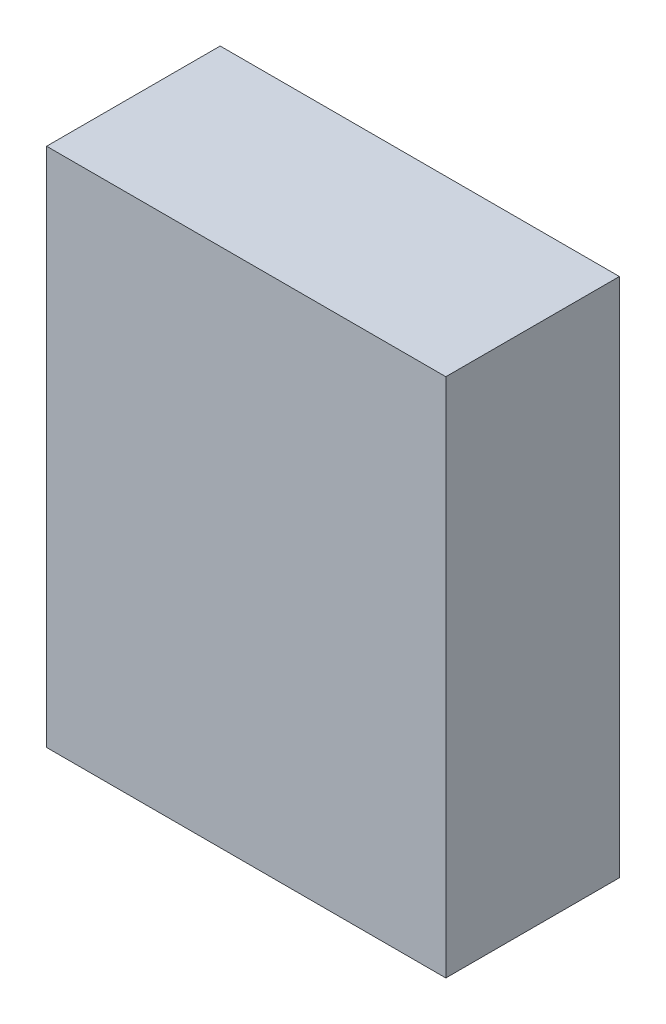
ISO-10303-21;
HEADER;
FILE_DESCRIPTION(('STEP AP214'),'2;1');
FILE_NAME('part.step','',(''),(''),'','','');
FILE_SCHEMA(('AUTOMOTIVE_DESIGN { 1 0 10303 214 1 1 1 1 }'));
ENDSEC;
DATA;
#1=APPLICATION_CONTEXT('core data for automotive mechanical design processes');
#2=APPLICATION_PROTOCOL_DEFINITION('international standard','automotive_design',2000,#1);
#3=PRODUCT_CONTEXT('',#1,'mechanical');
#4=PRODUCT('Part','Part','',(#3));
#5=PRODUCT_RELATED_PRODUCT_CATEGORY('part','',(#4));
#6=PRODUCT_DEFINITION_FORMATION('','',#4);
#7=PRODUCT_DEFINITION_CONTEXT('part definition',#1,'design');
#8=PRODUCT_DEFINITION('design','',#6,#7);
#9=PRODUCT_DEFINITION_SHAPE('','',#8);
#10=(LENGTH_UNIT() NAMED_UNIT(*) SI_UNIT(.MILLI.,.METRE.));
#11=(NAMED_UNIT(*) PLANE_ANGLE_UNIT() SI_UNIT($,.RADIAN.));
#12=(NAMED_UNIT(*) SI_UNIT($,.STERADIAN.) SOLID_ANGLE_UNIT());
#13=UNCERTAINTY_MEASURE_WITH_UNIT(LENGTH_MEASURE(1.E-05),#10,'distance_accuracy_value','');
#14=(GEOMETRIC_REPRESENTATION_CONTEXT(3) GLOBAL_UNCERTAINTY_ASSIGNED_CONTEXT((#13)) GLOBAL_UNIT_ASSIGNED_CONTEXT((#10,
#11,#12)) REPRESENTATION_CONTEXT('',''));
#15=CARTESIAN_POINT('',(0.,0.,0.));
#16=DIRECTION('',(0.,0.,1.));
#17=DIRECTION('',(1.,0.,0.));
#18=AXIS2_PLACEMENT_3D('',#15,#16,#17);
#19=CARTESIAN_POINT('',(-48.481774921507,22.1003401360544,50.));
#20=DIRECTION('',(1.,0.,0.));
#21=DIRECTION('',(0.,1.,0.));
#22=AXIS2_PLACEMENT_3D('',#19,#20,#21);
#23=PLANE('',#22);
#24=DIRECTION('',(0.,-1.,0.));
#25=VECTOR('',#24,1.);
#26=CARTESIAN_POINT('',(-48.481774921507,22.1003401360544,0.));
#27=LINE('',#26,#25);
#28=CARTESIAN_POINT('',(-48.481774921507,22.1003401360544,0.));
#29=VERTEX_POINT('',#28);
#30=CARTESIAN_POINT('',(-48.481774921507,-127.899659863946,0.));
#31=VERTEX_POINT('',#30);
#32=EDGE_CURVE('E107',#29,#31,#27,.T.);
#33=ORIENTED_EDGE('',*,*,#32,.T.);
#34=DIRECTION('',(0.,0.,-1.));
#35=VECTOR('',#34,1.);
#36=CARTESIAN_POINT('',(-48.481774921507,-127.899659863946,50.));
#37=LINE('',#36,#35);
#38=CARTESIAN_POINT('',(-48.481774921507,-127.899659863946,50.));
#39=VERTEX_POINT('',#38);
#40=EDGE_CURVE('E11',#39,#31,#37,.T.);
#41=ORIENTED_EDGE('',*,*,#40,.F.);
#42=DIRECTION('',(0.,-1.,0.));
#43=VECTOR('',#42,1.);
#44=CARTESIAN_POINT('',(-48.481774921507,22.1003401360544,50.));
#45=LINE('',#44,#43);
#46=CARTESIAN_POINT('',(-48.481774921507,22.1003401360544,50.));
#47=VERTEX_POINT('',#46);
#48=EDGE_CURVE('E91',#47,#39,#45,.T.);
#49=ORIENTED_EDGE('',*,*,#48,.F.);
#50=DIRECTION('',(0.,0.,-1.));
#51=VECTOR('',#50,1.);
#52=CARTESIAN_POINT('',(-48.481774921507,22.1003401360544,50.));
#53=LINE('',#52,#51);
#54=EDGE_CURVE('E103',#47,#29,#53,.T.);
#55=ORIENTED_EDGE('',*,*,#54,.T.);
#56=EDGE_LOOP('',(#33,#41,#49,#55));
#57=FACE_BOUND('',#56,.T.);
#58=ADVANCED_FACE('F39',(#57),#23,.F.);
#59=CARTESIAN_POINT('',(-48.481774921507,-127.899659863946,50.));
#60=DIRECTION('',(0.,1.,0.));
#61=DIRECTION('',(0.,0.,1.));
#62=AXIS2_PLACEMENT_3D('',#59,#60,#61);
#63=PLANE('',#62);
#64=DIRECTION('',(1.,0.,0.));
#65=VECTOR('',#64,1.);
#66=CARTESIAN_POINT('',(-48.481774921507,-127.899659863946,0.));
#67=LINE('',#66,#65);
#68=CARTESIAN_POINT('',(66.518225078493,-127.899659863946,0.));
#69=VERTEX_POINT('',#68);
#70=EDGE_CURVE('E96',#31,#69,#67,.T.);
#71=ORIENTED_EDGE('',*,*,#70,.T.);
#72=DIRECTION('',(0.,0.,-1.));
#73=VECTOR('',#72,1.);
#74=CARTESIAN_POINT('',(66.518225078493,-127.899659863946,50.));
#75=LINE('',#74,#73);
#76=CARTESIAN_POINT('',(66.518225078493,-127.899659863946,50.));
#77=VERTEX_POINT('',#76);
#78=EDGE_CURVE('E48',#77,#69,#75,.T.);
#79=ORIENTED_EDGE('',*,*,#78,.F.);
#80=DIRECTION('',(1.,0.,0.));
#81=VECTOR('',#80,1.);
#82=CARTESIAN_POINT('',(-48.481774921507,-127.899659863946,50.));
#83=LINE('',#82,#81);
#84=EDGE_CURVE('E86',#39,#77,#83,.T.);
#85=ORIENTED_EDGE('',*,*,#84,.F.);
#86=ORIENTED_EDGE('',*,*,#40,.T.);
#87=EDGE_LOOP('',(#71,#79,#85,#86));
#88=FACE_BOUND('',#87,.T.);
#89=ADVANCED_FACE('F95',(#88),#63,.F.);
#90=CARTESIAN_POINT('',(66.518225078493,22.1003401360544,50.));
#91=DIRECTION('',(-1.,0.,0.));
#92=DIRECTION('',(0.,0.,1.));
#93=AXIS2_PLACEMENT_3D('',#90,#91,#92);
#94=PLANE('',#93);
#95=DIRECTION('',(0.,1.,0.));
#96=VECTOR('',#95,1.);
#97=CARTESIAN_POINT('',(66.518225078493,22.1003401360544,0.));
#98=LINE('',#97,#96);
#99=CARTESIAN_POINT('',(66.518225078493,22.1003401360544,0.));
#100=VERTEX_POINT('',#99);
#101=EDGE_CURVE('E73',#69,#100,#98,.T.);
#102=ORIENTED_EDGE('',*,*,#101,.T.);
#103=DIRECTION('',(0.,0.,-1.));
#104=VECTOR('',#103,1.);
#105=CARTESIAN_POINT('',(66.518225078493,22.1003401360544,50.));
#106=LINE('',#105,#104);
#107=CARTESIAN_POINT('',(66.518225078493,22.1003401360544,50.));
#108=VERTEX_POINT('',#107);
#109=EDGE_CURVE('E98',#108,#100,#106,.T.);
#110=ORIENTED_EDGE('',*,*,#109,.F.);
#111=DIRECTION('',(0.,1.,0.));
#112=VECTOR('',#111,1.);
#113=CARTESIAN_POINT('',(66.518225078493,22.1003401360544,50.));
#114=LINE('',#113,#112);
#115=EDGE_CURVE('E89',#77,#108,#114,.T.);
#116=ORIENTED_EDGE('',*,*,#115,.F.);
#117=ORIENTED_EDGE('',*,*,#78,.T.);
#118=EDGE_LOOP('',(#102,#110,#116,#117));
#119=FACE_BOUND('',#118,.T.);
#120=ADVANCED_FACE('F99',(#119),#94,.F.);
#121=CARTESIAN_POINT('',(-48.481774921507,22.1003401360544,50.));
#122=DIRECTION('',(0.,-1.,0.));
#123=DIRECTION('',(0.,0.,-1.));
#124=AXIS2_PLACEMENT_3D('',#121,#122,#123);
#125=PLANE('',#124);
#126=DIRECTION('',(-1.,0.,0.));
#127=VECTOR('',#126,1.);
#128=CARTESIAN_POINT('',(-48.481774921507,22.1003401360544,0.));
#129=LINE('',#128,#127);
#130=EDGE_CURVE('E79',#100,#29,#129,.T.);
#131=ORIENTED_EDGE('',*,*,#130,.T.);
#132=ORIENTED_EDGE('',*,*,#54,.F.);
#133=DIRECTION('',(-1.,0.,0.));
#134=VECTOR('',#133,1.);
#135=CARTESIAN_POINT('',(-48.481774921507,22.1003401360544,50.));
#136=LINE('',#135,#134);
#137=EDGE_CURVE('E56',#108,#47,#136,.T.);
#138=ORIENTED_EDGE('',*,*,#137,.F.);
#139=ORIENTED_EDGE('',*,*,#109,.T.);
#140=EDGE_LOOP('',(#131,#132,#138,#139));
#141=FACE_BOUND('',#140,.T.);
#142=ADVANCED_FACE('F120',(#141),#125,.F.);
#143=CARTESIAN_POINT('',(0.,0.,50.));
#144=DIRECTION('',(0.,0.,1.));
#145=DIRECTION('',(1.,0.,0.));
#146=AXIS2_PLACEMENT_3D('',#143,#144,#145);
#147=PLANE('',#146);
#148=ORIENTED_EDGE('',*,*,#48,.T.);
#149=ORIENTED_EDGE('',*,*,#84,.T.);
#150=ORIENTED_EDGE('',*,*,#115,.T.);
#151=ORIENTED_EDGE('',*,*,#137,.T.);
#152=EDGE_LOOP('',(#148,#149,#150,#151));
#153=FACE_BOUND('',#152,.T.);
#154=ADVANCED_FACE('F87',(#153),#147,.T.);
#155=CARTESIAN_POINT('',(0.,0.,0.));
#156=DIRECTION('',(0.,0.,1.));
#157=DIRECTION('',(1.,0.,0.));
#158=AXIS2_PLACEMENT_3D('',#155,#156,#157);
#159=PLANE('',#158);
#160=ORIENTED_EDGE('',*,*,#32,.F.);
#161=ORIENTED_EDGE('',*,*,#130,.F.);
#162=ORIENTED_EDGE('',*,*,#101,.F.);
#163=ORIENTED_EDGE('',*,*,#70,.F.);
#164=EDGE_LOOP('',(#160,#161,#162,#163));
#165=FACE_BOUND('',#164,.T.);
#166=ADVANCED_FACE('F123',(#165),#159,.F.);
#167=CLOSED_SHELL('',(#58,#89,#120,#142,#154,#166));
#168=MANIFOLD_SOLID_BREP('B2',#167);
#169=ADVANCED_BREP_SHAPE_REPRESENTATION('',(#18,#168),#14);
#170=SHAPE_DEFINITION_REPRESENTATION(#9,#169);
ENDSEC;
END-ISO-10303-21;
